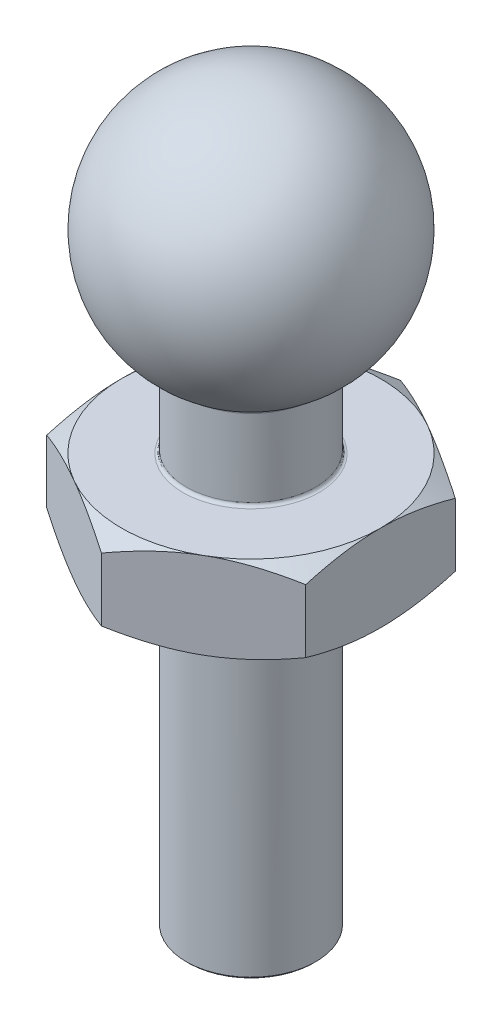
ISO-10303-21;
HEADER;
FILE_DESCRIPTION(('STEP AP214'),'2;1');
FILE_NAME('part.step','',(''),(''),'','','');
FILE_SCHEMA(('AUTOMOTIVE_DESIGN { 1 0 10303 214 1 1 1 1 }'));
ENDSEC;
DATA;
#1=APPLICATION_CONTEXT('core data for automotive mechanical design processes');
#2=APPLICATION_PROTOCOL_DEFINITION('international standard','automotive_design',2000,#1);
#3=PRODUCT_CONTEXT('',#1,'mechanical');
#4=PRODUCT('Part','Part','',(#3));
#5=PRODUCT_RELATED_PRODUCT_CATEGORY('part','',(#4));
#6=PRODUCT_DEFINITION_FORMATION('','',#4);
#7=PRODUCT_DEFINITION_CONTEXT('part definition',#1,'design');
#8=PRODUCT_DEFINITION('design','',#6,#7);
#9=PRODUCT_DEFINITION_SHAPE('','',#8);
#10=(LENGTH_UNIT() NAMED_UNIT(*) SI_UNIT(.MILLI.,.METRE.));
#11=(NAMED_UNIT(*) PLANE_ANGLE_UNIT() SI_UNIT($,.RADIAN.));
#12=(NAMED_UNIT(*) SI_UNIT($,.STERADIAN.) SOLID_ANGLE_UNIT());
#13=UNCERTAINTY_MEASURE_WITH_UNIT(LENGTH_MEASURE(1.E-05),#10,'distance_accuracy_value','');
#14=(GEOMETRIC_REPRESENTATION_CONTEXT(3) GLOBAL_UNCERTAINTY_ASSIGNED_CONTEXT((#13)) GLOBAL_UNIT_ASSIGNED_CONTEXT((#10,
#11,#12)) REPRESENTATION_CONTEXT('',''));
#15=CARTESIAN_POINT('',(0.,0.,0.));
#16=DIRECTION('',(0.,0.,1.));
#17=DIRECTION('',(1.,0.,0.));
#18=AXIS2_PLACEMENT_3D('',#15,#16,#17);
#19=CARTESIAN_POINT('',(3.,9.5,-1.73205080756888));
#20=DIRECTION('',(-0.5,0.,0.866025403784439));
#21=DIRECTION('',(0.866025403784439,0.,0.5));
#22=AXIS2_PLACEMENT_3D('',#19,#20,#21);
#23=PLANE('',#22);
#24=CARTESIAN_POINT('',(3.0002,9.23198413756899,-1.73193533751504));
#25=CARTESIAN_POINT('',(2.86836479341167,9.27594629554769,-1.80805042952748));
#26=CARTESIAN_POINT('',(2.73539159464475,9.31592841370737,-1.88482254163057));
#27=CARTESIAN_POINT('',(2.46714257999794,9.38571791955454,-2.03969618244675));
#28=CARTESIAN_POINT('',(2.33186199736566,9.41550061773462,-2.11780046324563));
#29=CARTESIAN_POINT('',(2.06297739790352,9.46186216078874,-2.27304105912605));
#30=CARTESIAN_POINT('',(1.92941475457054,9.47874955887705,-2.35015348720802));
#31=CARTESIAN_POINT('',(1.66166094270431,9.49891035755148,-2.50474122256554));
#32=CARTESIAN_POINT('',(1.52747074752016,9.50220045221892,-2.58221596787771));
#33=CARTESIAN_POINT('',(1.27672440230419,9.49535946911461,-2.72698443778647));
#34=CARTESIAN_POINT('',(1.16013073502732,9.48690808580738,-2.79429982297457));
#35=CARTESIAN_POINT('',(0.927703015025363,9.46012105699296,-2.92849202968483));
#36=CARTESIAN_POINT('',(0.811869766348668,9.44177625913829,-2.99536838698943));
#37=CARTESIAN_POINT('',(0.578962742943631,9.39591524914667,-3.12983731964848));
#38=CARTESIAN_POINT('',(0.461918449486058,9.36820461473692,-3.19741287398332));
#39=CARTESIAN_POINT('',(0.229575649500875,9.3053122048626,-3.33155605209904));
#40=CARTESIAN_POINT('',(0.114274165828894,9.27014520897844,-3.39812539473502));
#41=CARTESIAN_POINT('',(-0.000200000000000033,9.23198413756899,-3.46421708519159));
#42=B_SPLINE_CURVE_WITH_KNOTS('',3,(#24,#25,#26,#27,#28,#29,#30,#31,#32,#33,#34,#35,#36,#37,#38,
#39,#40,#41),.UNSPECIFIED.,.F.,.F.,(4,2,2,2,2,2,2,2,4),(0.,0.475539830103041,0.952222784107964,
1.41710776961288,1.88142182298026,2.28572436316091,2.69040156475039,3.10405572063576,
3.5168974940707),.UNSPECIFIED.);
#43=CARTESIAN_POINT('',(3.,9.2320508075689,-1.73205080756891));
#44=VERTEX_POINT('',#43);
#45=CARTESIAN_POINT('',(1.5,9.5,-2.59807621135332));
#46=VERTEX_POINT('',#45);
#47=EDGE_CURVE('E161',#44,#46,#42,.T.);
#48=ORIENTED_EDGE('',*,*,#47,.F.);
#49=DIRECTION('',(0.,-1.,0.));
#50=VECTOR('',#49,1.);
#51=CARTESIAN_POINT('',(3.,9.5,-1.73205080756888));
#52=LINE('',#51,#50);
#53=CARTESIAN_POINT('',(3.,7.76794919243112,-1.73205080756888));
#54=VERTEX_POINT('',#53);
#55=EDGE_CURVE('E282',#44,#54,#52,.T.);
#56=ORIENTED_EDGE('',*,*,#55,.T.);
#57=CARTESIAN_POINT('',(-0.000199999999999975,7.76801586243101,-3.46421708519159));
#58=CARTESIAN_POINT('',(0.131635206588332,7.7240537044523,-3.38810199317915));
#59=CARTESIAN_POINT('',(0.264608405355249,7.68407158629263,-3.31132988107606));
#60=CARTESIAN_POINT('',(0.532857420002056,7.61428208044546,-3.15645624025988));
#61=CARTESIAN_POINT('',(0.668138002634341,7.58449938226538,-3.078351959461));
#62=CARTESIAN_POINT('',(0.937022602096483,7.53813783921126,-2.92311136358059));
#63=CARTESIAN_POINT('',(1.07058524542946,7.52125044112295,-2.84599893549861));
#64=CARTESIAN_POINT('',(1.33833905729569,7.50108964244852,-2.6914112001411));
#65=CARTESIAN_POINT('',(1.47252925247984,7.49779954778108,-2.61393645482892));
#66=CARTESIAN_POINT('',(1.72327559769581,7.50464053088539,-2.46916798492017));
#67=CARTESIAN_POINT('',(1.83986926497268,7.51309191419262,-2.40185259973206));
#68=CARTESIAN_POINT('',(2.07229698497464,7.53987894300703,-2.2676603930218));
#69=CARTESIAN_POINT('',(2.18813023365133,7.55822374086171,-2.2007840357172));
#70=CARTESIAN_POINT('',(2.42103725705637,7.60408475085333,-2.06631510305815));
#71=CARTESIAN_POINT('',(2.53808155051394,7.63179538526308,-1.99873954872331));
#72=CARTESIAN_POINT('',(2.77042435049912,7.6946877951374,-1.86459637060759));
#73=CARTESIAN_POINT('',(2.8857258341711,7.72985479102156,-1.79802702797161));
#74=CARTESIAN_POINT('',(3.0002,7.76801586243101,-1.73193533751504));
#75=B_SPLINE_CURVE_WITH_KNOTS('',3,(#57,#58,#59,#60,#61,#62,#63,#64,#65,#66,#67,#68,#69,#70,#71,
#72,#73,#74),.UNSPECIFIED.,.F.,.F.,(4,2,2,2,2,2,2,2,4),(0.,0.475539830103041,0.952222784107964,
1.41710776961288,1.88142182298026,2.28572436316091,2.69040156475039,3.10405572063576,
3.5168974940707),.UNSPECIFIED.);
#76=CARTESIAN_POINT('',(1.5,7.5,-2.59807621135332));
#77=VERTEX_POINT('',#76);
#78=EDGE_CURVE('E406',#77,#54,#75,.T.);
#79=ORIENTED_EDGE('',*,*,#78,.F.);
#80=CARTESIAN_POINT('',(0.,7.76794919243112,-3.46410161513775));
#81=VERTEX_POINT('',#80);
#82=EDGE_CURVE('E401',#81,#77,#75,.T.);
#83=ORIENTED_EDGE('',*,*,#82,.F.);
#84=DIRECTION('',(0.,-1.,0.));
#85=VECTOR('',#84,1.);
#86=CARTESIAN_POINT('',(0.,9.5,-3.46410161513775));
#87=LINE('',#86,#85);
#88=CARTESIAN_POINT('',(0.,9.23205080756888,-3.46410161513775));
#89=VERTEX_POINT('',#88);
#90=EDGE_CURVE('E192',#89,#81,#87,.T.);
#91=ORIENTED_EDGE('',*,*,#90,.F.);
#92=EDGE_CURVE('E172',#46,#89,#42,.T.);
#93=ORIENTED_EDGE('',*,*,#92,.F.);
#94=EDGE_LOOP('',(#48,#56,#79,#83,#91,#93));
#95=FACE_BOUND('',#94,.T.);
#96=ADVANCED_FACE('F72',(#95),#23,.F.);
#97=CARTESIAN_POINT('',(0.,9.5,-3.46410161513775));
#98=DIRECTION('',(0.5,0.,0.866025403784439));
#99=DIRECTION('',(0.866025403784439,0.,-0.5));
#100=AXIS2_PLACEMENT_3D('',#97,#98,#99);
#101=PLANE('',#100);
#102=CARTESIAN_POINT('',(0.000200000000000089,9.23198413756899,-3.46421708519159));
#103=CARTESIAN_POINT('',(-0.131635206588331,9.27594629554769,-3.38810199317915));
#104=CARTESIAN_POINT('',(-0.264608405355249,9.31592841370737,-3.31132988107606));
#105=CARTESIAN_POINT('',(-0.532857420002056,9.38571791955454,-3.15645624025988));
#106=CARTESIAN_POINT('',(-0.668138002634342,9.41550061773462,-3.078351959461));
#107=CARTESIAN_POINT('',(-0.937022602096483,9.46186216078874,-2.92311136358059));
#108=CARTESIAN_POINT('',(-1.07058524542946,9.47874955887705,-2.84599893549861));
#109=CARTESIAN_POINT('',(-1.33833905729569,9.49891035755148,-2.6914112001411));
#110=CARTESIAN_POINT('',(-1.47252925247984,9.50220045221892,-2.61393645482892));
#111=CARTESIAN_POINT('',(-1.72327559769581,9.49535946911461,-2.46916798492017));
#112=CARTESIAN_POINT('',(-1.83986926497268,9.48690808580738,-2.40185259973206));
#113=CARTESIAN_POINT('',(-2.07229698497464,9.46012105699296,-2.2676603930218));
#114=CARTESIAN_POINT('',(-2.18813023365133,9.44177625913829,-2.2007840357172));
#115=CARTESIAN_POINT('',(-2.42103725705637,9.39591524914667,-2.06631510305815));
#116=CARTESIAN_POINT('',(-2.53808155051394,9.36820461473692,-1.99873954872331));
#117=CARTESIAN_POINT('',(-2.77042435049913,9.3053122048626,-1.86459637060759));
#118=CARTESIAN_POINT('',(-2.88572583417111,9.27014520897844,-1.79802702797161));
#119=CARTESIAN_POINT('',(-3.0002,9.23198413756899,-1.73193533751504));
#120=B_SPLINE_CURVE_WITH_KNOTS('',3,(#102,#103,#104,#105,#106,#107,#108,#109,#110,#111,#112,
#113,#114,#115,#116,#117,#118,#119),.UNSPECIFIED.,.F.,.F.,(4,2,2,2,2,2,2,2,4),(0.,
0.47553983010304,0.952222784107964,1.41710776961288,1.88142182298026,2.28572436316091,
2.69040156475039,3.10405572063576,3.5168974940707),.UNSPECIFIED.);
#121=CARTESIAN_POINT('',(-1.5,9.5,-2.59807621135332));
#122=VERTEX_POINT('',#121);
#123=EDGE_CURVE('E179',#89,#122,#120,.T.);
#124=ORIENTED_EDGE('',*,*,#123,.F.);
#125=ORIENTED_EDGE('',*,*,#90,.T.);
#126=CARTESIAN_POINT('',(-3.0002,7.76801586243101,-1.73193533751504));
#127=CARTESIAN_POINT('',(-2.86836479341167,7.72405370445231,-1.80805042952748));
#128=CARTESIAN_POINT('',(-2.73539159464475,7.68407158629263,-1.88482254163057));
#129=CARTESIAN_POINT('',(-2.46714257999795,7.61428208044547,-2.03969618244675));
#130=CARTESIAN_POINT('',(-2.33186199736566,7.58449938226538,-2.11780046324563));
#131=CARTESIAN_POINT('',(-2.06297739790352,7.53813783921126,-2.27304105912605));
#132=CARTESIAN_POINT('',(-1.92941475457054,7.52125044112295,-2.35015348720802));
#133=CARTESIAN_POINT('',(-1.66166094270431,7.50108964244852,-2.50474122256553));
#134=CARTESIAN_POINT('',(-1.52747074752016,7.49779954778108,-2.58221596787771));
#135=CARTESIAN_POINT('',(-1.27672440230419,7.50464053088539,-2.72698443778646));
#136=CARTESIAN_POINT('',(-1.16013073502732,7.51309191419262,-2.79429982297457));
#137=CARTESIAN_POINT('',(-0.927703015025364,7.53987894300703,-2.92849202968483));
#138=CARTESIAN_POINT('',(-0.811869766348669,7.55822374086171,-2.99536838698943));
#139=CARTESIAN_POINT('',(-0.578962742943633,7.60408475085333,-3.12983731964848));
#140=CARTESIAN_POINT('',(-0.46191844948606,7.63179538526308,-3.19741287398332));
#141=CARTESIAN_POINT('',(-0.229575649500876,7.6946877951374,-3.33155605209904));
#142=CARTESIAN_POINT('',(-0.114274165828894,7.72985479102156,-3.39812539473502));
#143=CARTESIAN_POINT('',(0.000200000000000282,7.76801586243101,-3.46421708519159));
#144=B_SPLINE_CURVE_WITH_KNOTS('',3,(#126,#127,#128,#129,#130,#131,#132,#133,#134,#135,#136,
#137,#138,#139,#140,#141,#142,#143),.UNSPECIFIED.,.F.,.F.,(4,2,2,2,2,2,2,2,4),(0.,
0.47553983010304,0.952222784107964,1.41710776961288,1.88142182298026,2.28572436316091,
2.69040156475039,3.10405572063576,3.5168974940707),.UNSPECIFIED.);
#145=CARTESIAN_POINT('',(-1.5,7.5,-2.59807621135332));
#146=VERTEX_POINT('',#145);
#147=EDGE_CURVE('E276',#146,#81,#144,.T.);
#148=ORIENTED_EDGE('',*,*,#147,.F.);
#149=CARTESIAN_POINT('',(-3.,7.76794919243112,-1.73205080756888));
#150=VERTEX_POINT('',#149);
#151=EDGE_CURVE('E386',#150,#146,#144,.T.);
#152=ORIENTED_EDGE('',*,*,#151,.F.);
#153=DIRECTION('',(0.,-1.,0.));
#154=VECTOR('',#153,1.);
#155=CARTESIAN_POINT('',(-3.,9.5,-1.73205080756888));
#156=LINE('',#155,#154);
#157=CARTESIAN_POINT('',(-3.,9.23205080756888,-1.73205080756888));
#158=VERTEX_POINT('',#157);
#159=EDGE_CURVE('E294',#158,#150,#156,.T.);
#160=ORIENTED_EDGE('',*,*,#159,.F.);
#161=EDGE_CURVE('E195',#122,#158,#120,.T.);
#162=ORIENTED_EDGE('',*,*,#161,.F.);
#163=EDGE_LOOP('',(#124,#125,#148,#152,#160,#162));
#164=FACE_BOUND('',#163,.T.);
#165=ADVANCED_FACE('F259',(#164),#101,.F.);
#166=CARTESIAN_POINT('',(-3.,9.5,-1.73205080756888));
#167=DIRECTION('',(1.,0.,0.));
#168=DIRECTION('',(0.,0.,-1.));
#169=AXIS2_PLACEMENT_3D('',#166,#167,#168);
#170=PLANE('',#169);
#171=CARTESIAN_POINT('',(-3.,7.49669275597267,-5.73225080756888));
#172=CARTESIAN_POINT('',(-3.,7.56535762873894,-5.59799811373669));
#173=CARTESIAN_POINT('',(-3.,7.63362658074956,-5.46354106552017));
#174=CARTESIAN_POINT('',(-3.,7.7691751977503,-5.19412594711896));
#175=CARTESIAN_POINT('',(-3.,7.83645484167597,-5.05916786634262));
#176=CARTESIAN_POINT('',(-3.,7.96993872408742,-4.78843231789163));
#177=CARTESIAN_POINT('',(-3.,8.0361409223391,-4.65265384244875));
#178=CARTESIAN_POINT('',(-3.,8.16708055525372,-4.38038885038152));
#179=CARTESIAN_POINT('',(-3.,8.23181796851999,-4.24390232345015));
#180=CARTESIAN_POINT('',(-3.,8.36273075239076,-3.96310511366176));
#181=CARTESIAN_POINT('',(-3.,8.42881132731156,-3.81875010473635));
#182=CARTESIAN_POINT('',(-3.,8.55842928727965,-3.52890389215656));
#183=CARTESIAN_POINT('',(-3.,8.62196674541402,-3.38341272129836));
#184=CARTESIAN_POINT('',(-3.,8.74573518476893,-3.0911428032025));
#185=CARTESIAN_POINT('',(-3.,8.80596844827941,-2.94436502804428));
#186=CARTESIAN_POINT('',(-3.,8.92221294586851,-2.64909731827644));
#187=CARTESIAN_POINT('',(-3.,8.97822314680859,-2.50060697487877));
#188=CARTESIAN_POINT('',(-3.,9.09420348606466,-2.17495473766773));
#189=CARTESIAN_POINT('',(-3.,9.15309774811246,-1.99740334689548));
#190=CARTESIAN_POINT('',(-3.,9.26029523419006,-1.63917764376158));
#191=CARTESIAN_POINT('',(-3.,9.30860404614459,-1.45850503366086));
#192=CARTESIAN_POINT('',(-3.,9.39023263279609,-1.09720914532956));
#193=CARTESIAN_POINT('',(-3.,9.42381477693698,-0.916647599895757));
#194=CARTESIAN_POINT('',(-3.,9.46126742176692,-0.644079261802787));
#195=CARTESIAN_POINT('',(-3.,9.47159787377878,-0.552943422867094));
#196=CARTESIAN_POINT('',(-3.,9.48763454600052,-0.370270654947727));
#197=CARTESIAN_POINT('',(-3.,9.49334144079801,-0.278733786435309));
#198=CARTESIAN_POINT('',(-3.,9.49996614854262,-0.094407851772208));
#199=CARTESIAN_POINT('',(-3.,9.5008268616344,-0.0016167174607594));
#200=CARTESIAN_POINT('',(-3.,9.49757525562797,0.183877598413801));
#201=CARTESIAN_POINT('',(-3.,9.49346292019229,0.276580779686969));
#202=CARTESIAN_POINT('',(-3.,9.48041370767168,0.461668088480515));
#203=CARTESIAN_POINT('',(-3.,9.47147558711607,0.554052127589443));
#204=CARTESIAN_POINT('',(-3.,9.4490819835307,0.738276464049774));
#205=CARTESIAN_POINT('',(-3.,9.43562578745626,0.830116673244043));
#206=CARTESIAN_POINT('',(-3.,9.38848678345653,1.1081241349506));
#207=CARTESIAN_POINT('',(-3.,9.34831083516922,1.29320289274649));
#208=CARTESIAN_POINT('',(-3.,9.25483304091392,1.65992833453579));
#209=CARTESIAN_POINT('',(-3.,9.20152817481691,1.8415742184766));
#210=CARTESIAN_POINT('',(-3.,9.09001482170302,2.18718321983853));
#211=CARTESIAN_POINT('',(-3.,9.03254960886738,2.35139002090273));
#212=CARTESIAN_POINT('',(-3.,8.91157770593576,2.67757637701535));
#213=CARTESIAN_POINT('',(-3.,8.84806982210383,2.83955548471668));
#214=CARTESIAN_POINT('',(-3.,8.71649668995848,3.16180541641892));
#215=CARTESIAN_POINT('',(-3.,8.64842746398323,3.32207460435457));
#216=CARTESIAN_POINT('',(-3.,8.50888164672137,3.64112437712565));
#217=CARTESIAN_POINT('',(-3.,8.43740489080743,3.79990488959462));
#218=CARTESIAN_POINT('',(-3.,8.29572041514807,4.10783154121877));
#219=CARTESIAN_POINT('',(-3.,8.22564804300012,4.25704019529893));
#220=CARTESIAN_POINT('',(-3.,8.0836551872923,4.55457880885657));
#221=CARTESIAN_POINT('',(-3.,8.01173465191385,4.70290874355283));
#222=CARTESIAN_POINT('',(-3.,7.86663085724281,4.99841900754648));
#223=CARTESIAN_POINT('',(-3.,7.79345182235509,5.14560141584992));
#224=CARTESIAN_POINT('',(-3.,7.64590152942626,5.43935321353677));
#225=CARTESIAN_POINT('',(-3.,7.57153036655204,5.58592265068707));
#226=CARTESIAN_POINT('',(-3.,7.49669275597267,5.73225080756888));
#227=B_SPLINE_CURVE_WITH_KNOTS('',3,(#171,#172,#173,#174,#175,#176,#177,#178,#179,#180,#181,
#182,#183,#184,#185,#186,#187,#188,#189,#190,#191,#192,#193,#194,#195,#196,#197,#198,#199,#200,
#201,#202,#203,#204,#205,#206,#207,#208,#209,#210,#211,#212,#213,#214,#215,#216,#217,#218,#219,
#220,#221,#222,#223,#224,#225,#226),.UNSPECIFIED.,.F.,.F.,(4,2,2,2,2,2,2,2,2,2,2,2,2,2,2,2,2,2,
2,2,2,2,2,2,2,2,2,4),(0.,0.452382016001322,0.904773650265347,1.35794045354517,1.81111387213612,
2.2873771437625,2.76362671813268,3.23954308217786,3.71557550010852,4.27652369616462,
4.83717505756687,5.38738613645124,5.66244417939779,5.937462083513,6.21571369559986,
6.4939662218021,6.77229048018743,7.05065868449287,7.61810965270507,8.18569127741243,
8.70745206667822,9.2293161451901,9.75164138486646,10.2739918851653,10.7685068932809,
11.2630357817083,11.756143015984,12.2492110799155),.UNSPECIFIED.);
#228=CARTESIAN_POINT('',(-3.,9.5,0.));
#229=VERTEX_POINT('',#228);
#230=EDGE_CURVE('E253',#158,#229,#227,.T.);
#231=ORIENTED_EDGE('',*,*,#230,.F.);
#232=ORIENTED_EDGE('',*,*,#159,.T.);
#233=CARTESIAN_POINT('',(-3.,9.50330724402733,5.73225080756888));
#234=CARTESIAN_POINT('',(-3.,9.43464237126105,5.59799811373669));
#235=CARTESIAN_POINT('',(-3.,9.36637341925044,5.46354106552018));
#236=CARTESIAN_POINT('',(-3.,9.2308248022497,5.19412594711896));
#237=CARTESIAN_POINT('',(-3.,9.16354515832403,5.05916786634262));
#238=CARTESIAN_POINT('',(-3.,9.03006127591258,4.78843231789163));
#239=CARTESIAN_POINT('',(-3.,8.9638590776609,4.65265384244874));
#240=CARTESIAN_POINT('',(-3.,8.83291944474628,4.38038885038151));
#241=CARTESIAN_POINT('',(-3.,8.76818203148001,4.24390232345014));
#242=CARTESIAN_POINT('',(-3.,8.63726924760924,3.96310511366176));
#243=CARTESIAN_POINT('',(-3.,8.57118867268844,3.81875010473635));
#244=CARTESIAN_POINT('',(-3.,8.44157071272035,3.52890389215656));
#245=CARTESIAN_POINT('',(-3.,8.37803325458598,3.38341272129836));
#246=CARTESIAN_POINT('',(-3.,8.25426481523107,3.0911428032025));
#247=CARTESIAN_POINT('',(-3.,8.19403155172058,2.94436502804428));
#248=CARTESIAN_POINT('',(-3.,8.07778705413149,2.64909731827644));
#249=CARTESIAN_POINT('',(-3.,8.02177685319141,2.50060697487877));
#250=CARTESIAN_POINT('',(-3.,7.90579651393534,2.17495473766773));
#251=CARTESIAN_POINT('',(-3.,7.84690225188754,1.99740334689548));
#252=CARTESIAN_POINT('',(-3.,7.73970476580994,1.63917764376158));
#253=CARTESIAN_POINT('',(-3.,7.69139595385541,1.45850503366086));
#254=CARTESIAN_POINT('',(-3.,7.60976736720391,1.09720914532956));
#255=CARTESIAN_POINT('',(-3.,7.57618522306301,0.916647599895757));
#256=CARTESIAN_POINT('',(-3.,7.53873257823308,0.644079261802787));
#257=CARTESIAN_POINT('',(-3.,7.52840212622122,0.552943422867094));
#258=CARTESIAN_POINT('',(-3.,7.51236545399948,0.370270654947727));
#259=CARTESIAN_POINT('',(-3.,7.50665855920199,0.278733786435309));
#260=CARTESIAN_POINT('',(-3.,7.50003385145738,0.0944078517722078));
#261=CARTESIAN_POINT('',(-3.,7.4991731383656,0.00161671746075924));
#262=CARTESIAN_POINT('',(-3.,7.50242474437203,-0.183877598413802));
#263=CARTESIAN_POINT('',(-3.,7.50653707980771,-0.276580779686969));
#264=CARTESIAN_POINT('',(-3.,7.51958629232832,-0.461668088480515));
#265=CARTESIAN_POINT('',(-3.,7.52852441288393,-0.554052127589444));
#266=CARTESIAN_POINT('',(-3.,7.5509180164693,-0.738276464049774));
#267=CARTESIAN_POINT('',(-3.,7.56437421254374,-0.830116673244044));
#268=CARTESIAN_POINT('',(-3.,7.61151321654347,-1.1081241349506));
#269=CARTESIAN_POINT('',(-3.,7.65168916483078,-1.29320289274649));
#270=CARTESIAN_POINT('',(-3.,7.74516695908608,-1.65992833453579));
#271=CARTESIAN_POINT('',(-3.,7.7984718251831,-1.8415742184766));
#272=CARTESIAN_POINT('',(-3.,7.90998517829698,-2.18718321983853));
#273=CARTESIAN_POINT('',(-3.,7.96745039113262,-2.35139002090274));
#274=CARTESIAN_POINT('',(-3.,8.08842229406423,-2.67757637701535));
#275=CARTESIAN_POINT('',(-3.,8.15193017789617,-2.83955548471668));
#276=CARTESIAN_POINT('',(-3.,8.28350331004152,-3.16180541641892));
#277=CARTESIAN_POINT('',(-3.,8.35157253601678,-3.32207460435457));
#278=CARTESIAN_POINT('',(-3.,8.49111835327863,-3.64112437712565));
#279=CARTESIAN_POINT('',(-3.,8.56259510919257,-3.79990488959462));
#280=CARTESIAN_POINT('',(-3.,8.70427958485193,-4.10783154121877));
#281=CARTESIAN_POINT('',(-3.,8.77435195699987,-4.25704019529893));
#282=CARTESIAN_POINT('',(-3.,8.9163448127077,-4.55457880885657));
#283=CARTESIAN_POINT('',(-3.,8.98826534808615,-4.70290874355283));
#284=CARTESIAN_POINT('',(-3.,9.1333691427572,-4.99841900754647));
#285=CARTESIAN_POINT('',(-3.,9.20654817764491,-5.14560141584992));
#286=CARTESIAN_POINT('',(-3.,9.35409847057374,-5.43935321353677));
#287=CARTESIAN_POINT('',(-3.,9.42846963344796,-5.58592265068707));
#288=CARTESIAN_POINT('',(-3.,9.50330724402733,-5.73225080756888));
#289=B_SPLINE_CURVE_WITH_KNOTS('',3,(#233,#234,#235,#236,#237,#238,#239,#240,#241,#242,#243,
#244,#245,#246,#247,#248,#249,#250,#251,#252,#253,#254,#255,#256,#257,#258,#259,#260,#261,#262,
#263,#264,#265,#266,#267,#268,#269,#270,#271,#272,#273,#274,#275,#276,#277,#278,#279,#280,#281,
#282,#283,#284,#285,#286,#287,#288),.UNSPECIFIED.,.F.,.F.,(4,2,2,2,2,2,2,2,2,2,2,2,2,2,2,2,2,2,
2,2,2,2,2,2,2,2,2,4),(0.,0.452382016001322,0.90477365026535,1.35794045354517,1.81111387213612,
2.2873771437625,2.76362671813268,3.23954308217786,3.71557550010852,4.27652369616462,
4.83717505756687,5.38738613645124,5.66244417939779,5.937462083513,6.21571369559987,
6.4939662218021,6.77229048018743,7.05065868449287,7.61810965270507,8.18569127741244,
8.70745206667822,9.2293161451901,9.75164138486645,10.2739918851653,10.7685068932809,
11.2630357817083,11.756143015984,12.2492110799155),.UNSPECIFIED.);
#290=CARTESIAN_POINT('',(-3.,7.5,0.));
#291=VERTEX_POINT('',#290);
#292=EDGE_CURVE('E265',#291,#150,#289,.T.);
#293=ORIENTED_EDGE('',*,*,#292,.F.);
#294=CARTESIAN_POINT('',(-3.,7.76794919243112,1.73205080756888));
#295=VERTEX_POINT('',#294);
#296=EDGE_CURVE('E274',#295,#291,#289,.T.);
#297=ORIENTED_EDGE('',*,*,#296,.F.);
#298=DIRECTION('',(0.,-1.,0.));
#299=VECTOR('',#298,1.);
#300=CARTESIAN_POINT('',(-3.,9.5,1.73205080756888));
#301=LINE('',#300,#299);
#302=CARTESIAN_POINT('',(-3.,9.23205080756888,1.73205080756888));
#303=VERTEX_POINT('',#302);
#304=EDGE_CURVE('E291',#303,#295,#301,.T.);
#305=ORIENTED_EDGE('',*,*,#304,.F.);
#306=EDGE_CURVE('E246',#229,#303,#227,.T.);
#307=ORIENTED_EDGE('',*,*,#306,.F.);
#308=EDGE_LOOP('',(#231,#232,#293,#297,#305,#307));
#309=FACE_BOUND('',#308,.T.);
#310=ADVANCED_FACE('F255',(#309),#170,.F.);
#311=CARTESIAN_POINT('',(-3.,9.5,1.73205080756888));
#312=DIRECTION('',(0.5,0.,-0.866025403784439));
#313=DIRECTION('',(-0.866025403784439,0.,-0.5));
#314=AXIS2_PLACEMENT_3D('',#311,#312,#313);
#315=PLANE('',#314);
#316=CARTESIAN_POINT('',(-3.0002,9.23198413756899,1.73193533751504));
#317=CARTESIAN_POINT('',(-2.86836479341167,9.27594629554769,1.80805042952748));
#318=CARTESIAN_POINT('',(-2.73539159464475,9.31592841370737,1.88482254163057));
#319=CARTESIAN_POINT('',(-2.46714257999794,9.38571791955453,2.03969618244676));
#320=CARTESIAN_POINT('',(-2.33186199736566,9.41550061773462,2.11780046324564));
#321=CARTESIAN_POINT('',(-2.06297739790352,9.46186216078874,2.27304105912605));
#322=CARTESIAN_POINT('',(-1.92941475457054,9.47874955887705,2.35015348720802));
#323=CARTESIAN_POINT('',(-1.66166094270431,9.49891035755148,2.50474122256554));
#324=CARTESIAN_POINT('',(-1.52747074752016,9.50220045221892,2.58221596787771));
#325=CARTESIAN_POINT('',(-1.27672440230419,9.49535946911461,2.72698443778647));
#326=CARTESIAN_POINT('',(-1.16013073502732,9.48690808580738,2.79429982297457));
#327=CARTESIAN_POINT('',(-0.927703015025364,9.46012105699296,2.92849202968484));
#328=CARTESIAN_POINT('',(-0.811869766348669,9.44177625913829,2.99536838698943));
#329=CARTESIAN_POINT('',(-0.578962742943633,9.39591524914667,3.12983731964849));
#330=CARTESIAN_POINT('',(-0.46191844948606,9.36820461473692,3.19741287398333));
#331=CARTESIAN_POINT('',(-0.229575649500876,9.3053122048626,3.33155605209904));
#332=CARTESIAN_POINT('',(-0.114274165828895,9.27014520897844,3.39812539473502));
#333=CARTESIAN_POINT('',(0.000199999999998983,9.23198413756899,3.46421708519159));
#334=B_SPLINE_CURVE_WITH_KNOTS('',3,(#316,#317,#318,#319,#320,#321,#322,#323,#324,#325,#326,
#327,#328,#329,#330,#331,#332,#333),.UNSPECIFIED.,.F.,.F.,(4,2,2,2,2,2,2,2,4),(0.,
0.475539830103041,0.952222784107964,1.41710776961288,1.88142182298026,2.28572436316091,
2.69040156475039,3.10405572063576,3.5168974940707),.UNSPECIFIED.);
#335=CARTESIAN_POINT('',(-1.5,9.5,2.59807621135332));
#336=VERTEX_POINT('',#335);
#337=EDGE_CURVE('E254',#303,#336,#334,.T.);
#338=ORIENTED_EDGE('',*,*,#337,.F.);
#339=ORIENTED_EDGE('',*,*,#304,.T.);
#340=CARTESIAN_POINT('',(0.000199999999999416,7.76801586243101,3.46421708519159));
#341=CARTESIAN_POINT('',(-0.131635206588332,7.72405370445231,3.38810199317915));
#342=CARTESIAN_POINT('',(-0.26460840535525,7.68407158629263,3.31132988107607));
#343=CARTESIAN_POINT('',(-0.532857420002056,7.61428208044547,3.15645624025988));
#344=CARTESIAN_POINT('',(-0.668138002634342,7.58449938226538,3.078351959461));
#345=CARTESIAN_POINT('',(-0.937022602096484,7.53813783921126,2.92311136358059));
#346=CARTESIAN_POINT('',(-1.07058524542946,7.52125044112295,2.84599893549862));
#347=CARTESIAN_POINT('',(-1.33833905729569,7.50108964244852,2.6914112001411));
#348=CARTESIAN_POINT('',(-1.47252925247984,7.49779954778108,2.61393645482892));
#349=CARTESIAN_POINT('',(-1.72327559769581,7.50464053088539,2.46916798492017));
#350=CARTESIAN_POINT('',(-1.83986926497268,7.51309191419262,2.40185259973206));
#351=CARTESIAN_POINT('',(-2.07229698497464,7.53987894300704,2.2676603930218));
#352=CARTESIAN_POINT('',(-2.18813023365133,7.55822374086171,2.2007840357172));
#353=CARTESIAN_POINT('',(-2.42103725705637,7.60408475085333,2.06631510305815));
#354=CARTESIAN_POINT('',(-2.53808155051394,7.63179538526308,1.99873954872331));
#355=CARTESIAN_POINT('',(-2.77042435049913,7.6946877951374,1.86459637060759));
#356=CARTESIAN_POINT('',(-2.88572583417111,7.72985479102156,1.79802702797161));
#357=CARTESIAN_POINT('',(-3.0002,7.76801586243101,1.73193533751504));
#358=B_SPLINE_CURVE_WITH_KNOTS('',3,(#340,#341,#342,#343,#344,#345,#346,#347,#348,#349,#350,
#351,#352,#353,#354,#355,#356,#357),.UNSPECIFIED.,.F.,.F.,(4,2,2,2,2,2,2,2,4),(0.,
0.475539830103041,0.952222784107964,1.41710776961288,1.88142182298026,2.28572436316091,
2.69040156475039,3.10405572063576,3.5168974940707),.UNSPECIFIED.);
#359=CARTESIAN_POINT('',(-1.5,7.5,2.59807621135332));
#360=VERTEX_POINT('',#359);
#361=EDGE_CURVE('E275',#360,#295,#358,.T.);
#362=ORIENTED_EDGE('',*,*,#361,.F.);
#363=CARTESIAN_POINT('',(0.,7.76794919243112,3.46410161513776));
#364=VERTEX_POINT('',#363);
#365=EDGE_CURVE('E387',#364,#360,#358,.T.);
#366=ORIENTED_EDGE('',*,*,#365,.F.);
#367=DIRECTION('',(0.,-1.,0.));
#368=VECTOR('',#367,1.);
#369=CARTESIAN_POINT('',(0.,9.5,3.46410161513776));
#370=LINE('',#369,#368);
#371=CARTESIAN_POINT('',(0.,9.23205080756888,3.46410161513776));
#372=VERTEX_POINT('',#371);
#373=EDGE_CURVE('E288',#372,#364,#370,.T.);
#374=ORIENTED_EDGE('',*,*,#373,.F.);
#375=EDGE_CURVE('E240',#336,#372,#334,.T.);
#376=ORIENTED_EDGE('',*,*,#375,.F.);
#377=EDGE_LOOP('',(#338,#339,#362,#366,#374,#376));
#378=FACE_BOUND('',#377,.T.);
#379=ADVANCED_FACE('F258',(#378),#315,.F.);
#380=CARTESIAN_POINT('',(0.,9.5,3.46410161513776));
#381=DIRECTION('',(-0.5,0.,-0.866025403784439));
#382=DIRECTION('',(-0.866025403784439,0.,0.5));
#383=AXIS2_PLACEMENT_3D('',#380,#381,#382);
#384=PLANE('',#383);
#385=CARTESIAN_POINT('',(-0.000200000000000515,9.23198413756899,3.46421708519159));
#386=CARTESIAN_POINT('',(0.131635206588332,9.27594629554769,3.38810199317915));
#387=CARTESIAN_POINT('',(0.264608405355249,9.31592841370737,3.31132988107607));
#388=CARTESIAN_POINT('',(0.532857420002055,9.38571791955453,3.15645624025988));
#389=CARTESIAN_POINT('',(0.668138002634341,9.41550061773462,3.078351959461));
#390=CARTESIAN_POINT('',(0.937022602096483,9.46186216078874,2.92311136358059));
#391=CARTESIAN_POINT('',(1.07058524542946,9.47874955887705,2.84599893549862));
#392=CARTESIAN_POINT('',(1.33833905729569,9.49891035755148,2.6914112001411));
#393=CARTESIAN_POINT('',(1.47252925247984,9.50220045221892,2.61393645482892));
#394=CARTESIAN_POINT('',(1.72327559769581,9.49535946911461,2.46916798492017));
#395=CARTESIAN_POINT('',(1.83986926497268,9.48690808580738,2.40185259973206));
#396=CARTESIAN_POINT('',(2.07229698497464,9.46012105699296,2.2676603930218));
#397=CARTESIAN_POINT('',(2.18813023365133,9.44177625913829,2.2007840357172));
#398=CARTESIAN_POINT('',(2.42103725705637,9.39591524914667,2.06631510305815));
#399=CARTESIAN_POINT('',(2.53808155051394,9.36820461473692,1.99873954872331));
#400=CARTESIAN_POINT('',(2.77042435049912,9.3053122048626,1.86459637060759));
#401=CARTESIAN_POINT('',(2.88572583417111,9.27014520897844,1.79802702797161));
#402=CARTESIAN_POINT('',(3.0002,9.23198413756899,1.73193533751504));
#403=B_SPLINE_CURVE_WITH_KNOTS('',3,(#385,#386,#387,#388,#389,#390,#391,#392,#393,#394,#395,
#396,#397,#398,#399,#400,#401,#402),.UNSPECIFIED.,.F.,.F.,(4,2,2,2,2,2,2,2,4),(0.,
0.47553983010304,0.952222784107964,1.41710776961288,1.88142182298026,2.28572436316091,
2.69040156475039,3.10405572063576,3.5168974940707),.UNSPECIFIED.);
#404=CARTESIAN_POINT('',(1.5,9.5,2.59807621135332));
#405=VERTEX_POINT('',#404);
#406=EDGE_CURVE('E449',#372,#405,#403,.T.);
#407=ORIENTED_EDGE('',*,*,#406,.F.);
#408=ORIENTED_EDGE('',*,*,#373,.T.);
#409=CARTESIAN_POINT('',(3.0002,7.76801586243101,1.73193533751504));
#410=CARTESIAN_POINT('',(2.86836479341167,7.72405370445231,1.80805042952749));
#411=CARTESIAN_POINT('',(2.73539159464475,7.68407158629263,1.88482254163057));
#412=CARTESIAN_POINT('',(2.46714257999794,7.61428208044547,2.03969618244676));
#413=CARTESIAN_POINT('',(2.33186199736566,7.58449938226538,2.11780046324564));
#414=CARTESIAN_POINT('',(2.06297739790352,7.53813783921126,2.27304105912605));
#415=CARTESIAN_POINT('',(1.92941475457054,7.52125044112295,2.35015348720802));
#416=CARTESIAN_POINT('',(1.66166094270431,7.50108964244852,2.50474122256554));
#417=CARTESIAN_POINT('',(1.52747074752015,7.49779954778108,2.58221596787772));
#418=CARTESIAN_POINT('',(1.27672440230419,7.50464053088539,2.72698443778647));
#419=CARTESIAN_POINT('',(1.16013073502732,7.51309191419262,2.79429982297457));
#420=CARTESIAN_POINT('',(0.927703015025362,7.53987894300704,2.92849202968484));
#421=CARTESIAN_POINT('',(0.811869766348667,7.55822374086171,2.99536838698944));
#422=CARTESIAN_POINT('',(0.578962742943631,7.60408475085333,3.12983731964849));
#423=CARTESIAN_POINT('',(0.461918449486058,7.63179538526308,3.19741287398333));
#424=CARTESIAN_POINT('',(0.229575649500874,7.6946877951374,3.33155605209904));
#425=CARTESIAN_POINT('',(0.114274165828893,7.72985479102156,3.39812539473502));
#426=CARTESIAN_POINT('',(-0.000200000000000808,7.76801586243101,3.46421708519159));
#427=B_SPLINE_CURVE_WITH_KNOTS('',3,(#409,#410,#411,#412,#413,#414,#415,#416,#417,#418,#419,
#420,#421,#422,#423,#424,#425,#426),.UNSPECIFIED.,.F.,.F.,(4,2,2,2,2,2,2,2,4),(0.,
0.475539830103041,0.952222784107964,1.41710776961288,1.88142182298026,2.28572436316091,
2.69040156475039,3.10405572063576,3.5168974940707),.UNSPECIFIED.);
#428=CARTESIAN_POINT('',(1.5,7.5,2.59807621135332));
#429=VERTEX_POINT('',#428);
#430=EDGE_CURVE('E395',#429,#364,#427,.T.);
#431=ORIENTED_EDGE('',*,*,#430,.F.);
#432=CARTESIAN_POINT('',(3.,7.7679491924311,1.73205080756891));
#433=VERTEX_POINT('',#432);
#434=EDGE_CURVE('E403',#433,#429,#427,.T.);
#435=ORIENTED_EDGE('',*,*,#434,.F.);
#436=DIRECTION('',(0.,-1.,0.));
#437=VECTOR('',#436,1.);
#438=CARTESIAN_POINT('',(3.,9.5,1.73205080756888));
#439=LINE('',#438,#437);
#440=CARTESIAN_POINT('',(3.,9.23205080756888,1.73205080756888));
#441=VERTEX_POINT('',#440);
#442=EDGE_CURVE('E285',#441,#433,#439,.T.);
#443=ORIENTED_EDGE('',*,*,#442,.F.);
#444=EDGE_CURVE('E232',#405,#441,#403,.T.);
#445=ORIENTED_EDGE('',*,*,#444,.F.);
#446=EDGE_LOOP('',(#407,#408,#431,#435,#443,#445));
#447=FACE_BOUND('',#446,.T.);
#448=ADVANCED_FACE('F436',(#447),#384,.F.);
#449=CARTESIAN_POINT('',(3.,9.5,1.73205080756888));
#450=DIRECTION('',(-1.,0.,0.));
#451=DIRECTION('',(0.,0.,1.));
#452=AXIS2_PLACEMENT_3D('',#449,#450,#451);
#453=PLANE('',#452);
#454=CARTESIAN_POINT('',(3.,7.49669275597267,5.73225080756888));
#455=CARTESIAN_POINT('',(3.,7.56535762873894,5.59799811373669));
#456=CARTESIAN_POINT('',(3.,7.63362658074956,5.46354106552018));
#457=CARTESIAN_POINT('',(3.,7.7691751977503,5.19412594711896));
#458=CARTESIAN_POINT('',(3.,7.83645484167597,5.05916786634262));
#459=CARTESIAN_POINT('',(3.,7.96993872408742,4.78843231789163));
#460=CARTESIAN_POINT('',(3.,8.0361409223391,4.65265384244875));
#461=CARTESIAN_POINT('',(3.,8.16708055525372,4.38038885038152));
#462=CARTESIAN_POINT('',(3.,8.23181796851998,4.24390232345015));
#463=CARTESIAN_POINT('',(3.,8.36273075239075,3.96310511366177));
#464=CARTESIAN_POINT('',(3.,8.42881132731156,3.81875010473635));
#465=CARTESIAN_POINT('',(3.,8.55842928727965,3.52890389215656));
#466=CARTESIAN_POINT('',(3.,8.62196674541402,3.38341272129837));
#467=CARTESIAN_POINT('',(3.,8.74573518476893,3.0911428032025));
#468=CARTESIAN_POINT('',(3.,8.80596844827941,2.94436502804428));
#469=CARTESIAN_POINT('',(3.,8.92221294586851,2.64909731827645));
#470=CARTESIAN_POINT('',(3.,8.97822314680859,2.50060697487878));
#471=CARTESIAN_POINT('',(3.,9.09420348606466,2.17495473766774));
#472=CARTESIAN_POINT('',(3.,9.15309774811246,1.99740334689548));
#473=CARTESIAN_POINT('',(3.,9.26029523419006,1.63917764376159));
#474=CARTESIAN_POINT('',(3.,9.30860404614459,1.45850503366087));
#475=CARTESIAN_POINT('',(3.,9.39023263279609,1.09720914532956));
#476=CARTESIAN_POINT('',(3.,9.42381477693698,0.916647599895762));
#477=CARTESIAN_POINT('',(3.,9.46126742176692,0.644079261802792));
#478=CARTESIAN_POINT('',(3.,9.47159787377878,0.552943422867099));
#479=CARTESIAN_POINT('',(3.,9.48763454600052,0.370270654947732));
#480=CARTESIAN_POINT('',(3.,9.49334144079801,0.278733786435314));
#481=CARTESIAN_POINT('',(3.,9.49996614854262,0.0944078517722127));
#482=CARTESIAN_POINT('',(3.,9.5008268616344,0.00161671746076431));
#483=CARTESIAN_POINT('',(3.,9.49757525562797,-0.183877598413797));
#484=CARTESIAN_POINT('',(3.,9.49346292019229,-0.276580779686964));
#485=CARTESIAN_POINT('',(3.,9.48041370767168,-0.461668088480511));
#486=CARTESIAN_POINT('',(3.,9.47147558711607,-0.554052127589439));
#487=CARTESIAN_POINT('',(3.,9.4490819835307,-0.73827646404977));
#488=CARTESIAN_POINT('',(3.,9.43562578745626,-0.83011667324404));
#489=CARTESIAN_POINT('',(3.,9.38848678345654,-1.1081241349506));
#490=CARTESIAN_POINT('',(3.,9.34831083516922,-1.29320289274649));
#491=CARTESIAN_POINT('',(3.,9.25483304091392,-1.65992833453579));
#492=CARTESIAN_POINT('',(3.,9.20152817481691,-1.8415742184766));
#493=CARTESIAN_POINT('',(3.,9.09001482170303,-2.18718321983853));
#494=CARTESIAN_POINT('',(3.,9.03254960886738,-2.35139002090273));
#495=CARTESIAN_POINT('',(3.,8.91157770593577,-2.67757637701535));
#496=CARTESIAN_POINT('',(3.,8.84806982210383,-2.83955548471668));
#497=CARTESIAN_POINT('',(3.,8.71649668995848,-3.16180541641892));
#498=CARTESIAN_POINT('',(3.,8.64842746398323,-3.32207460435456));
#499=CARTESIAN_POINT('',(3.,8.50888164672137,-3.64112437712565));
#500=CARTESIAN_POINT('',(3.,8.43740489080743,-3.79990488959462));
#501=CARTESIAN_POINT('',(3.,8.29572041514807,-4.10783154121877));
#502=CARTESIAN_POINT('',(3.,8.22564804300012,-4.25704019529893));
#503=CARTESIAN_POINT('',(3.,8.0836551872923,-4.55457880885657));
#504=CARTESIAN_POINT('',(3.,8.01173465191385,-4.70290874355283));
#505=CARTESIAN_POINT('',(3.,7.86663085724281,-4.99841900754648));
#506=CARTESIAN_POINT('',(3.,7.79345182235509,-5.14560141584992));
#507=CARTESIAN_POINT('',(3.,7.64590152942626,-5.43935321353677));
#508=CARTESIAN_POINT('',(3.,7.57153036655204,-5.58592265068707));
#509=CARTESIAN_POINT('',(3.,7.49669275597267,-5.73225080756888));
#510=B_SPLINE_CURVE_WITH_KNOTS('',3,(#454,#455,#456,#457,#458,#459,#460,#461,#462,#463,#464,
#465,#466,#467,#468,#469,#470,#471,#472,#473,#474,#475,#476,#477,#478,#479,#480,#481,#482,#483,
#484,#485,#486,#487,#488,#489,#490,#491,#492,#493,#494,#495,#496,#497,#498,#499,#500,#501,#502,
#503,#504,#505,#506,#507,#508,#509),.UNSPECIFIED.,.F.,.F.,(4,2,2,2,2,2,2,2,2,2,2,2,2,2,2,2,2,2,
2,2,2,2,2,2,2,2,2,4),(0.,0.452382016001322,0.904773650265349,1.35794045354517,1.81111387213612,
2.2873771437625,2.76362671813268,3.23954308217786,3.71557550010852,4.27652369616462,
4.83717505756687,5.38738613645124,5.66244417939779,5.937462083513,6.21571369559987,
6.4939662218021,6.77229048018743,7.05065868449287,7.61810965270507,8.18569127741244,
8.70745206667822,9.2293161451901,9.75164138486646,10.2739918851653,10.7685068932809,
11.2630357817083,11.756143015984,12.2492110799155),.UNSPECIFIED.);
#511=CARTESIAN_POINT('',(3.,9.5,0.));
#512=VERTEX_POINT('',#511);
#513=EDGE_CURVE('E458',#441,#512,#510,.T.);
#514=ORIENTED_EDGE('',*,*,#513,.F.);
#515=ORIENTED_EDGE('',*,*,#442,.T.);
#516=CARTESIAN_POINT('',(3.,9.50330724402733,-5.73225080756888));
#517=CARTESIAN_POINT('',(3.,9.43464237126106,-5.59799811373669));
#518=CARTESIAN_POINT('',(3.,9.36637341925044,-5.46354106552018));
#519=CARTESIAN_POINT('',(3.,9.2308248022497,-5.19412594711896));
#520=CARTESIAN_POINT('',(3.,9.16354515832403,-5.05916786634262));
#521=CARTESIAN_POINT('',(3.,9.03006127591258,-4.78843231789163));
#522=CARTESIAN_POINT('',(3.,8.9638590776609,-4.65265384244875));
#523=CARTESIAN_POINT('',(3.,8.83291944474628,-4.38038885038152));
#524=CARTESIAN_POINT('',(3.,8.76818203148001,-4.24390232345015));
#525=CARTESIAN_POINT('',(3.,8.63726924760924,-3.96310511366176));
#526=CARTESIAN_POINT('',(3.,8.57118867268844,-3.81875010473635));
#527=CARTESIAN_POINT('',(3.,8.44157071272035,-3.52890389215656));
#528=CARTESIAN_POINT('',(3.,8.37803325458598,-3.38341272129836));
#529=CARTESIAN_POINT('',(3.,8.25426481523107,-3.0911428032025));
#530=CARTESIAN_POINT('',(3.,8.19403155172058,-2.94436502804428));
#531=CARTESIAN_POINT('',(3.,8.07778705413149,-2.64909731827644));
#532=CARTESIAN_POINT('',(3.,8.02177685319141,-2.50060697487877));
#533=CARTESIAN_POINT('',(3.,7.90579651393534,-2.17495473766774));
#534=CARTESIAN_POINT('',(3.,7.84690225188754,-1.99740334689548));
#535=CARTESIAN_POINT('',(3.,7.73970476580994,-1.63917764376158));
#536=CARTESIAN_POINT('',(3.,7.69139595385541,-1.45850503366087));
#537=CARTESIAN_POINT('',(3.,7.60976736720391,-1.09720914532956));
#538=CARTESIAN_POINT('',(3.,7.57618522306302,-0.916647599895759));
#539=CARTESIAN_POINT('',(3.,7.53873257823308,-0.644079261802789));
#540=CARTESIAN_POINT('',(3.,7.52840212622122,-0.552943422867096));
#541=CARTESIAN_POINT('',(3.,7.51236545399948,-0.370270654947729));
#542=CARTESIAN_POINT('',(3.,7.50665855920199,-0.278733786435311));
#543=CARTESIAN_POINT('',(3.,7.50003385145738,-0.0944078517722096));
#544=CARTESIAN_POINT('',(3.,7.4991731383656,-0.00161671746076088));
#545=CARTESIAN_POINT('',(3.,7.50242474437203,0.1838775984138));
#546=CARTESIAN_POINT('',(3.,7.50653707980771,0.276580779686968));
#547=CARTESIAN_POINT('',(3.,7.51958629232832,0.461668088480514));
#548=CARTESIAN_POINT('',(3.,7.52852441288393,0.554052127589443));
#549=CARTESIAN_POINT('',(3.,7.5509180164693,0.738276464049774));
#550=CARTESIAN_POINT('',(3.,7.56437421254374,0.830116673244043));
#551=CARTESIAN_POINT('',(3.,7.61151321654347,1.1081241349506));
#552=CARTESIAN_POINT('',(3.,7.65168916483078,1.29320289274649));
#553=CARTESIAN_POINT('',(3.,7.74516695908608,1.65992833453579));
#554=CARTESIAN_POINT('',(3.,7.79847182518309,1.8415742184766));
#555=CARTESIAN_POINT('',(3.,7.90998517829698,2.18718321983853));
#556=CARTESIAN_POINT('',(3.,7.96745039113261,2.35139002090273));
#557=CARTESIAN_POINT('',(3.,8.08842229406423,2.67757637701535));
#558=CARTESIAN_POINT('',(3.,8.15193017789617,2.83955548471668));
#559=CARTESIAN_POINT('',(3.,8.28350331004152,3.16180541641892));
#560=CARTESIAN_POINT('',(3.,8.35157253601677,3.32207460435457));
#561=CARTESIAN_POINT('',(3.,8.49111835327863,3.64112437712565));
#562=CARTESIAN_POINT('',(3.,8.56259510919257,3.79990488959462));
#563=CARTESIAN_POINT('',(3.,8.70427958485193,4.10783154121877));
#564=CARTESIAN_POINT('',(3.,8.77435195699988,4.25704019529893));
#565=CARTESIAN_POINT('',(3.,8.9163448127077,4.55457880885657));
#566=CARTESIAN_POINT('',(3.,8.98826534808616,4.70290874355283));
#567=CARTESIAN_POINT('',(3.,9.1333691427572,4.99841900754648));
#568=CARTESIAN_POINT('',(3.,9.20654817764491,5.14560141584992));
#569=CARTESIAN_POINT('',(3.,9.35409847057375,5.43935321353678));
#570=CARTESIAN_POINT('',(3.,9.42846963344796,5.58592265068708));
#571=CARTESIAN_POINT('',(3.,9.50330724402733,5.73225080756888));
#572=B_SPLINE_CURVE_WITH_KNOTS('',3,(#516,#517,#518,#519,#520,#521,#522,#523,#524,#525,#526,
#527,#528,#529,#530,#531,#532,#533,#534,#535,#536,#537,#538,#539,#540,#541,#542,#543,#544,#545,
#546,#547,#548,#549,#550,#551,#552,#553,#554,#555,#556,#557,#558,#559,#560,#561,#562,#563,#564,
#565,#566,#567,#568,#569,#570,#571),.UNSPECIFIED.,.F.,.F.,(4,2,2,2,2,2,2,2,2,2,2,2,2,2,2,2,2,2,
2,2,2,2,2,2,2,2,2,4),(0.,0.452382016001323,0.90477365026535,1.35794045354517,1.81111387213612,
2.2873771437625,2.76362671813268,3.23954308217786,3.71557550010852,4.27652369616462,
4.83717505756687,5.38738613645125,5.66244417939779,5.93746208351301,6.21571369559987,
6.4939662218021,6.77229048018743,7.05065868449288,7.61810965270508,8.18569127741244,
8.70745206667822,9.2293161451901,9.75164138486646,10.2739918851653,10.7685068932809,
11.2630357817083,11.756143015984,12.2492110799155),.UNSPECIFIED.);
#573=CARTESIAN_POINT('',(3.,7.5,0.));
#574=VERTEX_POINT('',#573);
#575=EDGE_CURVE('E421',#574,#433,#572,.T.);
#576=ORIENTED_EDGE('',*,*,#575,.F.);
#577=EDGE_CURVE('E412',#54,#574,#572,.T.);
#578=ORIENTED_EDGE('',*,*,#577,.F.);
#579=ORIENTED_EDGE('',*,*,#55,.F.);
#580=EDGE_CURVE('E166',#512,#44,#510,.T.);
#581=ORIENTED_EDGE('',*,*,#580,.F.);
#582=EDGE_LOOP('',(#514,#515,#576,#578,#579,#581));
#583=FACE_BOUND('',#582,.T.);
#584=ADVANCED_FACE('F431',(#583),#453,.F.);
#585=CARTESIAN_POINT('',(0.,7.5,0.));
#586=DIRECTION('',(0.,1.,0.));
#587=DIRECTION('',(0.,0.,-1.));
#588=AXIS2_PLACEMENT_3D('',#585,#586,#587);
#589=CONICAL_SURFACE('',#588,3.,1.0471975511966);
#590=ORIENTED_EDGE('',*,*,#365,.T.);
#591=CARTESIAN_POINT('',(0.,7.5,0.));
#592=DIRECTION('',(0.,1.,0.));
#593=DIRECTION('',(0.,0.,1.));
#594=AXIS2_PLACEMENT_3D('',#591,#592,#593);
#595=CIRCLE('',#594,3.);
#596=EDGE_CURVE('E311',#360,#429,#595,.T.);
#597=ORIENTED_EDGE('',*,*,#596,.T.);
#598=ORIENTED_EDGE('',*,*,#430,.T.);
#599=EDGE_LOOP('',(#590,#597,#598));
#600=FACE_BOUND('',#599,.T.);
#601=ADVANCED_FACE('F435',(#600),#589,.T.);
#602=ORIENTED_EDGE('',*,*,#296,.T.);
#603=EDGE_CURVE('E314',#291,#360,#595,.T.);
#604=ORIENTED_EDGE('',*,*,#603,.T.);
#605=ORIENTED_EDGE('',*,*,#361,.T.);
#606=EDGE_LOOP('',(#602,#604,#605));
#607=FACE_BOUND('',#606,.T.);
#608=ADVANCED_FACE('F217',(#607),#589,.T.);
#609=ORIENTED_EDGE('',*,*,#292,.T.);
#610=ORIENTED_EDGE('',*,*,#151,.T.);
#611=EDGE_CURVE('E471',#146,#291,#595,.T.);
#612=ORIENTED_EDGE('',*,*,#611,.T.);
#613=EDGE_LOOP('',(#609,#610,#612));
#614=FACE_BOUND('',#613,.T.);
#615=ADVANCED_FACE('F482',(#614),#589,.T.);
#616=ORIENTED_EDGE('',*,*,#147,.T.);
#617=ORIENTED_EDGE('',*,*,#82,.T.);
#618=EDGE_CURVE('E470',#77,#146,#595,.T.);
#619=ORIENTED_EDGE('',*,*,#618,.T.);
#620=EDGE_LOOP('',(#616,#617,#619));
#621=FACE_BOUND('',#620,.T.);
#622=ADVANCED_FACE('F484',(#621),#589,.T.);
#623=ORIENTED_EDGE('',*,*,#78,.T.);
#624=ORIENTED_EDGE('',*,*,#577,.T.);
#625=CARTESIAN_POINT('',(0.,7.5,0.));
#626=DIRECTION('',(0.,-1.,0.));
#627=DIRECTION('',(0.,0.,-1.));
#628=AXIS2_PLACEMENT_3D('',#625,#626,#627);
#629=CIRCLE('',#628,3.);
#630=EDGE_CURVE('E171',#77,#574,#629,.T.);
#631=ORIENTED_EDGE('',*,*,#630,.F.);
#632=EDGE_LOOP('',(#623,#624,#631));
#633=FACE_BOUND('',#632,.T.);
#634=ADVANCED_FACE('F463',(#633),#589,.T.);
#635=ORIENTED_EDGE('',*,*,#434,.T.);
#636=EDGE_CURVE('E315',#429,#574,#595,.T.);
#637=ORIENTED_EDGE('',*,*,#636,.T.);
#638=ORIENTED_EDGE('',*,*,#575,.T.);
#639=EDGE_LOOP('',(#635,#637,#638));
#640=FACE_BOUND('',#639,.T.);
#641=ADVANCED_FACE('F489',(#640),#589,.T.);
#642=CARTESIAN_POINT('',(0.,0.,0.));
#643=DIRECTION('',(0.,1.,0.));
#644=DIRECTION('',(-1.,0.,0.));
#645=AXIS2_PLACEMENT_3D('',#642,#643,#644);
#646=PLANE('',#645);
#647=CARTESIAN_POINT('',(0.,0.,0.));
#648=DIRECTION('',(0.,1.,0.));
#649=DIRECTION('',(-1.,0.,0.));
#650=AXIS2_PLACEMENT_3D('',#647,#648,#649);
#651=CIRCLE('',#650,1.45);
#652=CARTESIAN_POINT('',(-1.45,0.,0.));
#653=VERTEX_POINT('',#652);
#654=EDGE_CURVE('E307',#653,#653,#651,.F.);
#655=ORIENTED_EDGE('',*,*,#654,.T.);
#656=EDGE_LOOP('',(#655));
#657=FACE_BOUND('',#656,.T.);
#658=ADVANCED_FACE('F524',(#657),#646,.F.);
#659=CARTESIAN_POINT('',(0.,0.0500000000000014,0.));
#660=DIRECTION('',(0.,1.,0.));
#661=DIRECTION('',(-1.,0.,0.));
#662=AXIS2_PLACEMENT_3D('',#659,#660,#661);
#663=CONICAL_SURFACE('',#662,1.5,0.785398163397453);
#664=ORIENTED_EDGE('',*,*,#654,.F.);
#665=EDGE_LOOP('',(#664));
#666=FACE_BOUND('',#665,.T.);
#667=CARTESIAN_POINT('',(0.,0.0500000000000014,0.));
#668=DIRECTION('',(0.,1.,0.));
#669=DIRECTION('',(-1.,0.,0.));
#670=AXIS2_PLACEMENT_3D('',#667,#668,#669);
#671=CIRCLE('',#670,1.5);
#672=CARTESIAN_POINT('',(-1.5,0.0500000000000015,0.));
#673=VERTEX_POINT('',#672);
#674=EDGE_CURVE('E303',#673,#673,#671,.T.);
#675=ORIENTED_EDGE('',*,*,#674,.F.);
#676=EDGE_LOOP('',(#675));
#677=FACE_BOUND('',#676,.T.);
#678=ADVANCED_FACE('F520',(#666,#677),#663,.T.);
#679=CARTESIAN_POINT('',(0.,11.,0.));
#680=DIRECTION('',(0.,1.,0.));
#681=DIRECTION('',(-1.,0.,0.));
#682=AXIS2_PLACEMENT_3D('',#679,#680,#681);
#683=CYLINDRICAL_SURFACE('',#682,1.5);
#684=ORIENTED_EDGE('',*,*,#674,.T.);
#685=EDGE_LOOP('',(#684));
#686=FACE_BOUND('',#685,.T.);
#687=CARTESIAN_POINT('',(0.,7.5,0.));
#688=DIRECTION('',(0.,1.,0.));
#689=DIRECTION('',(0.,0.,1.));
#690=AXIS2_PLACEMENT_3D('',#687,#688,#689);
#691=CIRCLE('',#690,1.5);
#692=CARTESIAN_POINT('',(0.,7.5,1.5));
#693=VERTEX_POINT('',#692);
#694=EDGE_CURVE('E299',#693,#693,#691,.T.);
#695=ORIENTED_EDGE('',*,*,#694,.F.);
#696=EDGE_LOOP('',(#695));
#697=FACE_BOUND('',#696,.T.);
#698=ADVANCED_FACE('F344',(#686,#697),#683,.T.);
#699=CARTESIAN_POINT('',(0.,7.5,0.));
#700=DIRECTION('',(0.,1.,0.));
#701=DIRECTION('',(0.,0.,1.));
#702=AXIS2_PLACEMENT_3D('',#699,#700,#701);
#703=PLANE('',#702);
#704=ORIENTED_EDGE('',*,*,#694,.T.);
#705=EDGE_LOOP('',(#704));
#706=FACE_BOUND('',#705,.T.);
#707=ORIENTED_EDGE('',*,*,#636,.F.);
#708=ORIENTED_EDGE('',*,*,#596,.F.);
#709=ORIENTED_EDGE('',*,*,#603,.F.);
#710=ORIENTED_EDGE('',*,*,#611,.F.);
#711=ORIENTED_EDGE('',*,*,#618,.F.);
#712=ORIENTED_EDGE('',*,*,#630,.T.);
#713=EDGE_LOOP('',(#707,#708,#709,#710,#711,#712));
#714=FACE_BOUND('',#713,.T.);
#715=ADVANCED_FACE('F438',(#706,#714),#703,.F.);
#716=CARTESIAN_POINT('',(0.,9.5,0.));
#717=DIRECTION('',(0.,-1.,0.));
#718=DIRECTION('',(0.,0.,1.));
#719=AXIS2_PLACEMENT_3D('',#716,#717,#718);
#720=CONICAL_SURFACE('',#719,3.,1.0471975511966);
#721=ORIENTED_EDGE('',*,*,#375,.T.);
#722=ORIENTED_EDGE('',*,*,#406,.T.);
#723=CARTESIAN_POINT('',(0.,9.5,0.));
#724=DIRECTION('',(0.,1.,0.));
#725=DIRECTION('',(0.,0.,1.));
#726=AXIS2_PLACEMENT_3D('',#723,#724,#725);
#727=CIRCLE('',#726,3.);
#728=EDGE_CURVE('E189',#336,#405,#727,.T.);
#729=ORIENTED_EDGE('',*,*,#728,.F.);
#730=EDGE_LOOP('',(#721,#722,#729));
#731=FACE_BOUND('',#730,.T.);
#732=ADVANCED_FACE('F345',(#731),#720,.T.);
#733=ORIENTED_EDGE('',*,*,#306,.T.);
#734=ORIENTED_EDGE('',*,*,#337,.T.);
#735=EDGE_CURVE('E318',#229,#336,#727,.T.);
#736=ORIENTED_EDGE('',*,*,#735,.F.);
#737=EDGE_LOOP('',(#733,#734,#736));
#738=FACE_BOUND('',#737,.T.);
#739=ADVANCED_FACE('F368',(#738),#720,.T.);
#740=ORIENTED_EDGE('',*,*,#161,.T.);
#741=ORIENTED_EDGE('',*,*,#230,.T.);
#742=EDGE_CURVE('E184',#122,#229,#727,.T.);
#743=ORIENTED_EDGE('',*,*,#742,.F.);
#744=EDGE_LOOP('',(#740,#741,#743));
#745=FACE_BOUND('',#744,.T.);
#746=ADVANCED_FACE('F364',(#745),#720,.T.);
#747=ORIENTED_EDGE('',*,*,#92,.T.);
#748=ORIENTED_EDGE('',*,*,#123,.T.);
#749=EDGE_CURVE('E176',#46,#122,#727,.T.);
#750=ORIENTED_EDGE('',*,*,#749,.F.);
#751=EDGE_LOOP('',(#747,#748,#750));
#752=FACE_BOUND('',#751,.T.);
#753=ADVANCED_FACE('F177',(#752),#720,.T.);
#754=ORIENTED_EDGE('',*,*,#47,.T.);
#755=EDGE_CURVE('E164',#512,#46,#727,.T.);
#756=ORIENTED_EDGE('',*,*,#755,.F.);
#757=ORIENTED_EDGE('',*,*,#580,.T.);
#758=EDGE_LOOP('',(#754,#756,#757));
#759=FACE_BOUND('',#758,.T.);
#760=ADVANCED_FACE('F163',(#759),#720,.T.);
#761=ORIENTED_EDGE('',*,*,#444,.T.);
#762=ORIENTED_EDGE('',*,*,#513,.T.);
#763=CARTESIAN_POINT('',(0.,9.5,0.));
#764=DIRECTION('',(0.,1.,0.));
#765=DIRECTION('',(0.,0.,1.));
#766=AXIS2_PLACEMENT_3D('',#763,#764,#765);
#767=CIRCLE('',#766,3.);
#768=EDGE_CURVE('E88',#405,#512,#767,.T.);
#769=ORIENTED_EDGE('',*,*,#768,.F.);
#770=EDGE_LOOP('',(#761,#762,#769));
#771=FACE_BOUND('',#770,.T.);
#772=ADVANCED_FACE('F216',(#771),#720,.T.);
#773=CARTESIAN_POINT('',(0.,14.,0.));
#774=DIRECTION('',(0.,1.,0.));
#775=DIRECTION('',(1.,0.,0.));
#776=AXIS2_PLACEMENT_3D('',#773,#774,#775);
#777=SPHERICAL_SURFACE('',#776,3.);
#778=CARTESIAN_POINT('',(0.,11.4233926543914,0.));
#779=DIRECTION('',(0.,1.,0.));
#780=DIRECTION('',(-1.,0.,0.));
#781=AXIS2_PLACEMENT_3D('',#778,#779,#780);
#782=CIRCLE('',#781,1.53658536585366);
#783=CARTESIAN_POINT('',(-1.53658536585366,11.4233926543914,0.));
#784=VERTEX_POINT('',#783);
#785=EDGE_CURVE('E188',#784,#784,#782,.T.);
#786=ORIENTED_EDGE('',*,*,#785,.T.);
#787=EDGE_LOOP('',(#786));
#788=FACE_BOUND('',#787,.T.);
#789=ADVANCED_FACE('F337',(#788),#777,.T.);
#790=CARTESIAN_POINT('',(0.,11.3589774707511,0.));
#791=DIRECTION('',(0.,1.,0.));
#792=DIRECTION('',(-1.,0.,0.));
#793=AXIS2_PLACEMENT_3D('',#790,#791,#792);
#794=CIRCLE('',#793,1.5);
#795=CARTESIAN_POINT('',(-1.5,11.3589774707511,0.));
#796=VERTEX_POINT('',#795);
#797=EDGE_CURVE('E81',#796,#796,#794,.F.);
#798=ORIENTED_EDGE('',*,*,#797,.T.);
#799=EDGE_LOOP('',(#798));
#800=FACE_BOUND('',#799,.T.);
#801=CARTESIAN_POINT('',(0.,9.575,0.));
#802=DIRECTION('',(0.,1.,0.));
#803=DIRECTION('',(0.,0.,1.));
#804=AXIS2_PLACEMENT_3D('',#801,#802,#803);
#805=CIRCLE('',#804,1.5);
#806=CARTESIAN_POINT('',(0.,9.575,1.5));
#807=VERTEX_POINT('',#806);
#808=EDGE_CURVE('E322',#807,#807,#805,.T.);
#809=ORIENTED_EDGE('',*,*,#808,.T.);
#810=EDGE_LOOP('',(#809));
#811=FACE_BOUND('',#810,.T.);
#812=ADVANCED_FACE('F329',(#800,#811),#683,.T.);
#813=CARTESIAN_POINT('',(0.,9.5,0.));
#814=DIRECTION('',(0.,1.,0.));
#815=DIRECTION('',(0.,0.,1.));
#816=AXIS2_PLACEMENT_3D('',#813,#814,#815);
#817=PLANE('',#816);
#818=CARTESIAN_POINT('',(0.,9.5,0.));
#819=DIRECTION('',(0.,1.,0.));
#820=DIRECTION('',(0.,0.,1.));
#821=AXIS2_PLACEMENT_3D('',#818,#819,#820);
#822=CIRCLE('',#821,1.575);
#823=CARTESIAN_POINT('',(0.,9.5,1.575));
#824=VERTEX_POINT('',#823);
#825=EDGE_CURVE('E13',#824,#824,#822,.F.);
#826=ORIENTED_EDGE('',*,*,#825,.T.);
#827=EDGE_LOOP('',(#826));
#828=FACE_BOUND('',#827,.T.);
#829=ORIENTED_EDGE('',*,*,#728,.T.);
#830=ORIENTED_EDGE('',*,*,#768,.T.);
#831=ORIENTED_EDGE('',*,*,#755,.T.);
#832=ORIENTED_EDGE('',*,*,#749,.T.);
#833=ORIENTED_EDGE('',*,*,#742,.T.);
#834=ORIENTED_EDGE('',*,*,#735,.T.);
#835=EDGE_LOOP('',(#829,#830,#831,#832,#833,#834));
#836=FACE_BOUND('',#835,.T.);
#837=ADVANCED_FACE('F186',(#828,#836),#817,.T.);
#838=CARTESIAN_POINT('',(0.,11.3589774707511,0.));
#839=DIRECTION('',(0.,1.,0.));
#840=DIRECTION('',(-1.,0.,0.));
#841=AXIS2_PLACEMENT_3D('',#838,#839,#840);
#842=TOROIDAL_SURFACE('',#841,1.575,0.075);
#843=ORIENTED_EDGE('',*,*,#797,.F.);
#844=EDGE_LOOP('',(#843));
#845=FACE_BOUND('',#844,.T.);
#846=ORIENTED_EDGE('',*,*,#785,.F.);
#847=EDGE_LOOP('',(#846));
#848=FACE_BOUND('',#847,.T.);
#849=ADVANCED_FACE('F332',(#845,#848),#842,.F.);
#850=CARTESIAN_POINT('',(0.,9.575,0.));
#851=DIRECTION('',(0.,1.,0.));
#852=DIRECTION('',(0.,0.,1.));
#853=AXIS2_PLACEMENT_3D('',#850,#851,#852);
#854=TOROIDAL_SURFACE('',#853,1.575,0.075);
#855=ORIENTED_EDGE('',*,*,#825,.F.);
#856=EDGE_LOOP('',(#855));
#857=FACE_BOUND('',#856,.T.);
#858=ORIENTED_EDGE('',*,*,#808,.F.);
#859=EDGE_LOOP('',(#858));
#860=FACE_BOUND('',#859,.T.);
#861=ADVANCED_FACE('F74',(#857,#860),#854,.F.);
#862=CLOSED_SHELL('',(#96,#165,#310,#379,#448,#584,#601,#608,#615,#622,#634,#641,#658,#678,#698,
#715,#732,#739,#746,#753,#760,#772,#789,#812,#837,#849,#861));
#863=MANIFOLD_SOLID_BREP('B2',#862);
#864=ADVANCED_BREP_SHAPE_REPRESENTATION('',(#18,#863),#14);
#865=SHAPE_DEFINITION_REPRESENTATION(#9,#864);
ENDSEC;
END-ISO-10303-21;
